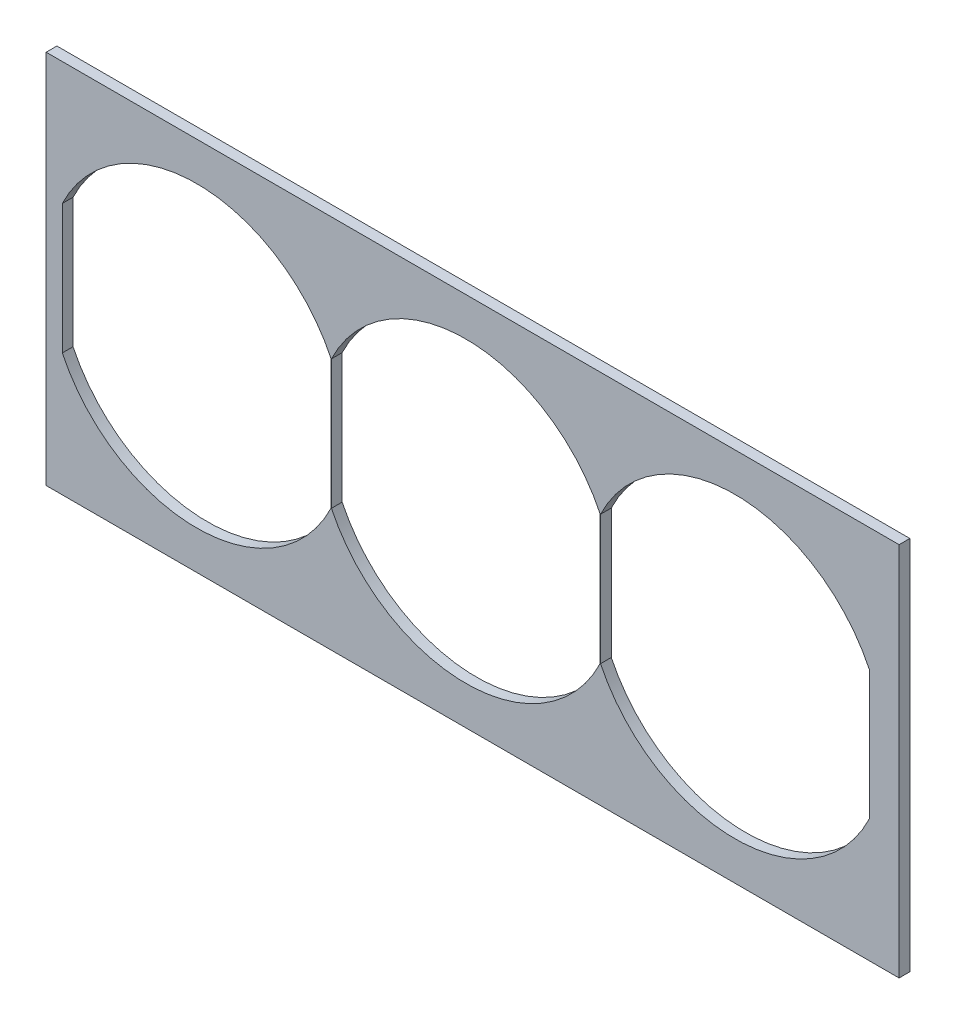
ISO-10303-21;
HEADER;
FILE_DESCRIPTION(('STEP AP214'),'2;1');
FILE_NAME('part.step','',(''),(''),'','','');
FILE_SCHEMA(('AUTOMOTIVE_DESIGN { 1 0 10303 214 1 1 1 1 }'));
ENDSEC;
DATA;
#1=APPLICATION_CONTEXT('core data for automotive mechanical design processes');
#2=APPLICATION_PROTOCOL_DEFINITION('international standard','automotive_design',2000,#1);
#3=PRODUCT_CONTEXT('',#1,'mechanical');
#4=PRODUCT('Part','Part','',(#3));
#5=PRODUCT_RELATED_PRODUCT_CATEGORY('part','',(#4));
#6=PRODUCT_DEFINITION_FORMATION('','',#4);
#7=PRODUCT_DEFINITION_CONTEXT('part definition',#1,'design');
#8=PRODUCT_DEFINITION('design','',#6,#7);
#9=PRODUCT_DEFINITION_SHAPE('','',#8);
#10=(LENGTH_UNIT() NAMED_UNIT(*) SI_UNIT(.MILLI.,.METRE.));
#11=(NAMED_UNIT(*) PLANE_ANGLE_UNIT() SI_UNIT($,.RADIAN.));
#12=(NAMED_UNIT(*) SI_UNIT($,.STERADIAN.) SOLID_ANGLE_UNIT());
#13=UNCERTAINTY_MEASURE_WITH_UNIT(LENGTH_MEASURE(1.E-05),#10,'distance_accuracy_value','');
#14=(GEOMETRIC_REPRESENTATION_CONTEXT(3) GLOBAL_UNCERTAINTY_ASSIGNED_CONTEXT((#13)) GLOBAL_UNIT_ASSIGNED_CONTEXT((#10,
#11,#12)) REPRESENTATION_CONTEXT('',''));
#15=CARTESIAN_POINT('',(0.,0.,0.));
#16=DIRECTION('',(0.,0.,1.));
#17=DIRECTION('',(1.,0.,0.));
#18=AXIS2_PLACEMENT_3D('',#15,#16,#17);
#19=CARTESIAN_POINT('',(158.75,-69.85,4.));
#20=DIRECTION('',(-1.,0.,0.));
#21=DIRECTION('',(0.,0.,1.));
#22=AXIS2_PLACEMENT_3D('',#19,#20,#21);
#23=PLANE('',#22);
#24=DIRECTION('',(0.,1.,0.));
#25=VECTOR('',#24,1.);
#26=CARTESIAN_POINT('',(158.75,-69.85,0.));
#27=LINE('',#26,#25);
#28=CARTESIAN_POINT('',(158.75,-69.85,0.));
#29=VERTEX_POINT('',#28);
#30=CARTESIAN_POINT('',(158.75,69.85,0.));
#31=VERTEX_POINT('',#30);
#32=EDGE_CURVE('E213',#29,#31,#27,.T.);
#33=ORIENTED_EDGE('',*,*,#32,.T.);
#34=DIRECTION('',(0.,0.,-1.));
#35=VECTOR('',#34,1.);
#36=CARTESIAN_POINT('',(158.75,69.85,4.));
#37=LINE('',#36,#35);
#38=CARTESIAN_POINT('',(158.75,69.85,4.));
#39=VERTEX_POINT('',#38);
#40=EDGE_CURVE('E246',#39,#31,#37,.T.);
#41=ORIENTED_EDGE('',*,*,#40,.F.);
#42=DIRECTION('',(0.,1.,0.));
#43=VECTOR('',#42,1.);
#44=CARTESIAN_POINT('',(158.75,-69.85,4.));
#45=LINE('',#44,#43);
#46=CARTESIAN_POINT('',(158.75,-69.85,4.));
#47=VERTEX_POINT('',#46);
#48=EDGE_CURVE('E220',#47,#39,#45,.T.);
#49=ORIENTED_EDGE('',*,*,#48,.F.);
#50=DIRECTION('',(0.,0.,-1.));
#51=VECTOR('',#50,1.);
#52=CARTESIAN_POINT('',(158.75,-69.85,4.));
#53=LINE('',#52,#51);
#54=EDGE_CURVE('E230',#47,#29,#53,.T.);
#55=ORIENTED_EDGE('',*,*,#54,.T.);
#56=EDGE_LOOP('',(#33,#41,#49,#55));
#57=FACE_BOUND('',#56,.T.);
#58=ADVANCED_FACE('F37',(#57),#23,.F.);
#59=CARTESIAN_POINT('',(-158.75,69.85,4.));
#60=DIRECTION('',(0.,-1.,0.));
#61=DIRECTION('',(0.,0.,-1.));
#62=AXIS2_PLACEMENT_3D('',#59,#60,#61);
#63=PLANE('',#62);
#64=DIRECTION('',(-1.,0.,0.));
#65=VECTOR('',#64,1.);
#66=CARTESIAN_POINT('',(-158.75,69.85,0.));
#67=LINE('',#66,#65);
#68=CARTESIAN_POINT('',(-158.75,69.85,0.));
#69=VERTEX_POINT('',#68);
#70=EDGE_CURVE('E233',#31,#69,#67,.T.);
#71=ORIENTED_EDGE('',*,*,#70,.T.);
#72=DIRECTION('',(0.,0.,-1.));
#73=VECTOR('',#72,1.);
#74=CARTESIAN_POINT('',(-158.75,69.85,4.));
#75=LINE('',#74,#73);
#76=CARTESIAN_POINT('',(-158.75,69.85,4.));
#77=VERTEX_POINT('',#76);
#78=EDGE_CURVE('E243',#77,#69,#75,.T.);
#79=ORIENTED_EDGE('',*,*,#78,.F.);
#80=DIRECTION('',(-1.,0.,0.));
#81=VECTOR('',#80,1.);
#82=CARTESIAN_POINT('',(-158.75,69.85,4.));
#83=LINE('',#82,#81);
#84=EDGE_CURVE('E223',#39,#77,#83,.T.);
#85=ORIENTED_EDGE('',*,*,#84,.F.);
#86=ORIENTED_EDGE('',*,*,#40,.T.);
#87=EDGE_LOOP('',(#71,#79,#85,#86));
#88=FACE_BOUND('',#87,.T.);
#89=ADVANCED_FACE('F303',(#88),#63,.F.);
#90=CARTESIAN_POINT('',(-158.75,-69.85,4.));
#91=DIRECTION('',(1.,0.,0.));
#92=DIRECTION('',(0.,0.,-1.));
#93=AXIS2_PLACEMENT_3D('',#90,#91,#92);
#94=PLANE('',#93);
#95=DIRECTION('',(0.,-1.,0.));
#96=VECTOR('',#95,1.);
#97=CARTESIAN_POINT('',(-158.75,-69.85,0.));
#98=LINE('',#97,#96);
#99=CARTESIAN_POINT('',(-158.75,-69.85,0.));
#100=VERTEX_POINT('',#99);
#101=EDGE_CURVE('E235',#69,#100,#98,.T.);
#102=ORIENTED_EDGE('',*,*,#101,.T.);
#103=DIRECTION('',(0.,0.,-1.));
#104=VECTOR('',#103,1.);
#105=CARTESIAN_POINT('',(-158.75,-69.85,4.));
#106=LINE('',#105,#104);
#107=CARTESIAN_POINT('',(-158.75,-69.85,4.));
#108=VERTEX_POINT('',#107);
#109=EDGE_CURVE('E240',#108,#100,#106,.T.);
#110=ORIENTED_EDGE('',*,*,#109,.F.);
#111=DIRECTION('',(0.,-1.,0.));
#112=VECTOR('',#111,1.);
#113=CARTESIAN_POINT('',(-158.75,-69.85,4.));
#114=LINE('',#113,#112);
#115=EDGE_CURVE('E226',#77,#108,#114,.T.);
#116=ORIENTED_EDGE('',*,*,#115,.F.);
#117=ORIENTED_EDGE('',*,*,#78,.T.);
#118=EDGE_LOOP('',(#102,#110,#116,#117));
#119=FACE_BOUND('',#118,.T.);
#120=ADVANCED_FACE('F298',(#119),#94,.F.);
#121=CARTESIAN_POINT('',(-158.75,-69.85,4.));
#122=DIRECTION('',(0.,1.,0.));
#123=DIRECTION('',(0.,0.,1.));
#124=AXIS2_PLACEMENT_3D('',#121,#122,#123);
#125=PLANE('',#124);
#126=DIRECTION('',(1.,0.,0.));
#127=VECTOR('',#126,1.);
#128=CARTESIAN_POINT('',(-158.75,-69.85,0.));
#129=LINE('',#128,#127);
#130=EDGE_CURVE('E224',#100,#29,#129,.T.);
#131=ORIENTED_EDGE('',*,*,#130,.T.);
#132=ORIENTED_EDGE('',*,*,#54,.F.);
#133=DIRECTION('',(1.,0.,0.));
#134=VECTOR('',#133,1.);
#135=CARTESIAN_POINT('',(-158.75,-69.85,4.));
#136=LINE('',#135,#134);
#137=EDGE_CURVE('E228',#108,#47,#136,.T.);
#138=ORIENTED_EDGE('',*,*,#137,.F.);
#139=ORIENTED_EDGE('',*,*,#109,.T.);
#140=EDGE_LOOP('',(#131,#132,#138,#139));
#141=FACE_BOUND('',#140,.T.);
#142=ADVANCED_FACE('F290',(#141),#125,.F.);
#143=CARTESIAN_POINT('',(0.,0.,4.));
#144=DIRECTION('',(0.,0.,-1.));
#145=DIRECTION('',(-1.,0.,0.));
#146=AXIS2_PLACEMENT_3D('',#143,#144,#145);
#147=PLANE('',#146);
#148=DIRECTION('',(0.,-1.,0.));
#149=VECTOR('',#148,1.);
#150=CARTESIAN_POINT('',(-152.7432,-24.0941777199389,4.));
#151=LINE('',#150,#149);
#152=CARTESIAN_POINT('',(-152.7432,24.0941777199389,4.));
#153=VERTEX_POINT('',#152);
#154=CARTESIAN_POINT('',(-152.7432,-24.0941777199389,4.));
#155=VERTEX_POINT('',#154);
#156=EDGE_CURVE('E183',#153,#155,#151,.T.);
#157=ORIENTED_EDGE('',*,*,#156,.F.);
#158=CARTESIAN_POINT('',(-102.7178,0.,4.));
#159=DIRECTION('',(0.,0.,1.));
#160=DIRECTION('',(1.,0.,0.));
#161=AXIS2_PLACEMENT_3D('',#158,#159,#160);
#162=CIRCLE('',#161,55.5254);
#163=CARTESIAN_POINT('',(-52.6924000000001,24.0941777199389,4.));
#164=VERTEX_POINT('',#163);
#165=EDGE_CURVE('E51',#164,#153,#162,.T.);
#166=ORIENTED_EDGE('',*,*,#165,.F.);
#167=DIRECTION('',(0.,1.,0.));
#168=VECTOR('',#167,1.);
#169=CARTESIAN_POINT('',(-52.6924,-24.0941777199389,4.));
#170=LINE('',#169,#168);
#171=CARTESIAN_POINT('',(-52.6924,-24.0941777199389,4.));
#172=VERTEX_POINT('',#171);
#173=EDGE_CURVE('E189',#172,#164,#170,.T.);
#174=ORIENTED_EDGE('',*,*,#173,.F.);
#175=CARTESIAN_POINT('',(-102.7178,0.,4.));
#176=DIRECTION('',(0.,0.,1.));
#177=DIRECTION('',(1.,0.,0.));
#178=AXIS2_PLACEMENT_3D('',#175,#176,#177);
#179=CIRCLE('',#178,55.5254);
#180=EDGE_CURVE('E186',#155,#172,#179,.T.);
#181=ORIENTED_EDGE('',*,*,#180,.F.);
#182=EDGE_LOOP('',(#157,#166,#174,#181));
#183=FACE_BOUND('',#182,.T.);
#184=DIRECTION('',(0.,-1.,0.));
#185=VECTOR('',#184,1.);
#186=CARTESIAN_POINT('',(47.6124,-24.0941777199391,4.));
#187=LINE('',#186,#185);
#188=CARTESIAN_POINT('',(47.6124,24.0941777199388,4.));
#189=VERTEX_POINT('',#188);
#190=CARTESIAN_POINT('',(47.6124,-24.0941777199391,4.));
#191=VERTEX_POINT('',#190);
#192=EDGE_CURVE('E165',#189,#191,#187,.T.);
#193=ORIENTED_EDGE('',*,*,#192,.F.);
#194=CARTESIAN_POINT('',(97.6378,-1.26105038336764E-13,4.));
#195=DIRECTION('',(0.,0.,1.));
#196=DIRECTION('',(1.,0.,0.));
#197=AXIS2_PLACEMENT_3D('',#194,#195,#196);
#198=CIRCLE('',#197,55.5254);
#199=CARTESIAN_POINT('',(147.6632,24.0941777199388,4.));
#200=VERTEX_POINT('',#199);
#201=EDGE_CURVE('E59',#200,#189,#198,.T.);
#202=ORIENTED_EDGE('',*,*,#201,.F.);
#203=DIRECTION('',(0.,1.,0.));
#204=VECTOR('',#203,1.);
#205=CARTESIAN_POINT('',(147.6632,-24.0941777199391,4.));
#206=LINE('',#205,#204);
#207=CARTESIAN_POINT('',(147.6632,-24.0941777199391,4.));
#208=VERTEX_POINT('',#207);
#209=EDGE_CURVE('E172',#208,#200,#206,.T.);
#210=ORIENTED_EDGE('',*,*,#209,.F.);
#211=CARTESIAN_POINT('',(97.6378,-1.26105038336764E-13,4.));
#212=DIRECTION('',(0.,0.,1.));
#213=DIRECTION('',(1.,0.,0.));
#214=AXIS2_PLACEMENT_3D('',#211,#212,#213);
#215=CIRCLE('',#214,55.5254);
#216=EDGE_CURVE('E155',#191,#208,#215,.T.);
#217=ORIENTED_EDGE('',*,*,#216,.F.);
#218=EDGE_LOOP('',(#193,#202,#210,#217));
#219=FACE_BOUND('',#218,.T.);
#220=DIRECTION('',(0.,-1.,0.));
#221=VECTOR('',#220,1.);
#222=CARTESIAN_POINT('',(-52.5654,-24.0941777199389,4.));
#223=LINE('',#222,#221);
#224=CARTESIAN_POINT('',(-52.5654,24.0941777199389,4.));
#225=VERTEX_POINT('',#224);
#226=CARTESIAN_POINT('',(-52.5654,-24.0941777199389,4.));
#227=VERTEX_POINT('',#226);
#228=EDGE_CURVE('E201',#225,#227,#223,.T.);
#229=ORIENTED_EDGE('',*,*,#228,.F.);
#230=CARTESIAN_POINT('',(-2.54,0.,4.));
#231=DIRECTION('',(0.,0.,1.));
#232=DIRECTION('',(1.,0.,0.));
#233=AXIS2_PLACEMENT_3D('',#230,#231,#232);
#234=CIRCLE('',#233,55.5254);
#235=CARTESIAN_POINT('',(47.4854,24.0941777199389,4.));
#236=VERTEX_POINT('',#235);
#237=EDGE_CURVE('E179',#236,#225,#234,.T.);
#238=ORIENTED_EDGE('',*,*,#237,.F.);
#239=DIRECTION('',(0.,1.,0.));
#240=VECTOR('',#239,1.);
#241=CARTESIAN_POINT('',(47.4854,-24.0941777199389,4.));
#242=LINE('',#241,#240);
#243=CARTESIAN_POINT('',(47.4854,-24.0941777199389,4.));
#244=VERTEX_POINT('',#243);
#245=EDGE_CURVE('E207',#244,#236,#242,.T.);
#246=ORIENTED_EDGE('',*,*,#245,.F.);
#247=CARTESIAN_POINT('',(-2.54,0.,4.));
#248=DIRECTION('',(0.,0.,1.));
#249=DIRECTION('',(1.,0.,0.));
#250=AXIS2_PLACEMENT_3D('',#247,#248,#249);
#251=CIRCLE('',#250,55.5254);
#252=EDGE_CURVE('E204',#227,#244,#251,.T.);
#253=ORIENTED_EDGE('',*,*,#252,.F.);
#254=EDGE_LOOP('',(#229,#238,#246,#253));
#255=FACE_BOUND('',#254,.T.);
#256=ORIENTED_EDGE('',*,*,#48,.T.);
#257=ORIENTED_EDGE('',*,*,#84,.T.);
#258=ORIENTED_EDGE('',*,*,#115,.T.);
#259=ORIENTED_EDGE('',*,*,#137,.T.);
#260=EDGE_LOOP('',(#256,#257,#258,#259));
#261=FACE_BOUND('',#260,.T.);
#262=ADVANCED_FACE('F169',(#183,#219,#255,#261),#147,.F.);
#263=CARTESIAN_POINT('',(0.,0.,0.));
#264=DIRECTION('',(0.,0.,-1.));
#265=DIRECTION('',(-1.,0.,0.));
#266=AXIS2_PLACEMENT_3D('',#263,#264,#265);
#267=PLANE('',#266);
#268=CARTESIAN_POINT('',(-102.7178,0.,0.));
#269=DIRECTION('',(0.,0.,-1.));
#270=DIRECTION('',(-1.,0.,0.));
#271=AXIS2_PLACEMENT_3D('',#268,#269,#270);
#272=CIRCLE('',#271,55.5254);
#273=CARTESIAN_POINT('',(-152.7432,24.0941777199389,0.));
#274=VERTEX_POINT('',#273);
#275=CARTESIAN_POINT('',(-52.6924000000001,24.0941777199389,0.));
#276=VERTEX_POINT('',#275);
#277=EDGE_CURVE('E11',#274,#276,#272,.T.);
#278=ORIENTED_EDGE('',*,*,#277,.F.);
#279=DIRECTION('',(0.,1.,0.));
#280=VECTOR('',#279,1.);
#281=CARTESIAN_POINT('',(-152.7432,0.,0.));
#282=LINE('',#281,#280);
#283=CARTESIAN_POINT('',(-152.7432,-24.0941777199389,0.));
#284=VERTEX_POINT('',#283);
#285=EDGE_CURVE('E265',#284,#274,#282,.T.);
#286=ORIENTED_EDGE('',*,*,#285,.F.);
#287=CARTESIAN_POINT('',(-102.7178,0.,0.));
#288=DIRECTION('',(0.,0.,-1.));
#289=DIRECTION('',(-1.,0.,0.));
#290=AXIS2_PLACEMENT_3D('',#287,#288,#289);
#291=CIRCLE('',#290,55.5254);
#292=CARTESIAN_POINT('',(-52.6924,-24.0941777199389,0.));
#293=VERTEX_POINT('',#292);
#294=EDGE_CURVE('E267',#293,#284,#291,.T.);
#295=ORIENTED_EDGE('',*,*,#294,.F.);
#296=DIRECTION('',(0.,-1.,0.));
#297=VECTOR('',#296,1.);
#298=CARTESIAN_POINT('',(-52.6924,0.,0.));
#299=LINE('',#298,#297);
#300=EDGE_CURVE('E44',#276,#293,#299,.T.);
#301=ORIENTED_EDGE('',*,*,#300,.F.);
#302=EDGE_LOOP('',(#278,#286,#295,#301));
#303=FACE_BOUND('',#302,.T.);
#304=CARTESIAN_POINT('',(97.6378,-1.26105038336764E-13,0.));
#305=DIRECTION('',(0.,0.,-1.));
#306=DIRECTION('',(-1.,0.,0.));
#307=AXIS2_PLACEMENT_3D('',#304,#305,#306);
#308=CIRCLE('',#307,55.5254);
#309=CARTESIAN_POINT('',(47.6124,24.0941777199388,0.));
#310=VERTEX_POINT('',#309);
#311=CARTESIAN_POINT('',(147.6632,24.0941777199388,0.));
#312=VERTEX_POINT('',#311);
#313=EDGE_CURVE('E263',#310,#312,#308,.T.);
#314=ORIENTED_EDGE('',*,*,#313,.F.);
#315=DIRECTION('',(0.,1.,0.));
#316=VECTOR('',#315,1.);
#317=CARTESIAN_POINT('',(47.6124,0.,0.));
#318=LINE('',#317,#316);
#319=CARTESIAN_POINT('',(47.6124,-24.0941777199391,0.));
#320=VERTEX_POINT('',#319);
#321=EDGE_CURVE('E258',#320,#310,#318,.T.);
#322=ORIENTED_EDGE('',*,*,#321,.F.);
#323=CARTESIAN_POINT('',(97.6378,-1.26105038336764E-13,0.));
#324=DIRECTION('',(0.,0.,-1.));
#325=DIRECTION('',(-1.,0.,0.));
#326=AXIS2_PLACEMENT_3D('',#323,#324,#325);
#327=CIRCLE('',#326,55.5254);
#328=CARTESIAN_POINT('',(147.6632,-24.0941777199391,0.));
#329=VERTEX_POINT('',#328);
#330=EDGE_CURVE('E158',#329,#320,#327,.T.);
#331=ORIENTED_EDGE('',*,*,#330,.F.);
#332=DIRECTION('',(0.,-1.,0.));
#333=VECTOR('',#332,1.);
#334=CARTESIAN_POINT('',(147.6632,-1.70102385766586E-13,0.));
#335=LINE('',#334,#333);
#336=EDGE_CURVE('E261',#312,#329,#335,.T.);
#337=ORIENTED_EDGE('',*,*,#336,.F.);
#338=EDGE_LOOP('',(#314,#322,#331,#337));
#339=FACE_BOUND('',#338,.T.);
#340=CARTESIAN_POINT('',(-2.54,0.,0.));
#341=DIRECTION('',(0.,0.,-1.));
#342=DIRECTION('',(-1.,0.,0.));
#343=AXIS2_PLACEMENT_3D('',#340,#341,#342);
#344=CIRCLE('',#343,55.5254);
#345=CARTESIAN_POINT('',(-52.5654,24.0941777199389,0.));
#346=VERTEX_POINT('',#345);
#347=CARTESIAN_POINT('',(47.4854,24.0941777199389,0.));
#348=VERTEX_POINT('',#347);
#349=EDGE_CURVE('E256',#346,#348,#344,.T.);
#350=ORIENTED_EDGE('',*,*,#349,.F.);
#351=DIRECTION('',(0.,1.,0.));
#352=VECTOR('',#351,1.);
#353=CARTESIAN_POINT('',(-52.5654,0.,0.));
#354=LINE('',#353,#352);
#355=CARTESIAN_POINT('',(-52.5654,-24.0941777199389,0.));
#356=VERTEX_POINT('',#355);
#357=EDGE_CURVE('E249',#356,#346,#354,.T.);
#358=ORIENTED_EDGE('',*,*,#357,.F.);
#359=CARTESIAN_POINT('',(-2.54,0.,0.));
#360=DIRECTION('',(0.,0.,-1.));
#361=DIRECTION('',(-1.,0.,0.));
#362=AXIS2_PLACEMENT_3D('',#359,#360,#361);
#363=CIRCLE('',#362,55.5254);
#364=CARTESIAN_POINT('',(47.4854,-24.0941777199389,0.));
#365=VERTEX_POINT('',#364);
#366=EDGE_CURVE('E251',#365,#356,#363,.T.);
#367=ORIENTED_EDGE('',*,*,#366,.F.);
#368=DIRECTION('',(0.,-1.,0.));
#369=VECTOR('',#368,1.);
#370=CARTESIAN_POINT('',(47.4854,0.,0.));
#371=LINE('',#370,#369);
#372=EDGE_CURVE('E254',#348,#365,#371,.T.);
#373=ORIENTED_EDGE('',*,*,#372,.F.);
#374=EDGE_LOOP('',(#350,#358,#367,#373));
#375=FACE_BOUND('',#374,.T.);
#376=ORIENTED_EDGE('',*,*,#32,.F.);
#377=ORIENTED_EDGE('',*,*,#130,.F.);
#378=ORIENTED_EDGE('',*,*,#101,.F.);
#379=ORIENTED_EDGE('',*,*,#70,.F.);
#380=EDGE_LOOP('',(#376,#377,#378,#379));
#381=FACE_BOUND('',#380,.T.);
#382=ADVANCED_FACE('F282',(#303,#339,#375,#381),#267,.T.);
#383=CARTESIAN_POINT('',(-2.54,0.,-6.));
#384=DIRECTION('',(0.,0.,1.));
#385=DIRECTION('',(1.,0.,0.));
#386=AXIS2_PLACEMENT_3D('',#383,#384,#385);
#387=CYLINDRICAL_SURFACE('',#386,55.5254);
#388=ORIENTED_EDGE('',*,*,#349,.T.);
#389=DIRECTION('',(0.,0.,1.));
#390=VECTOR('',#389,1.);
#391=CARTESIAN_POINT('',(47.4854,24.0941777199389,-6.));
#392=LINE('',#391,#390);
#393=EDGE_CURVE('E211',#348,#236,#392,.T.);
#394=ORIENTED_EDGE('',*,*,#393,.T.);
#395=ORIENTED_EDGE('',*,*,#237,.T.);
#396=DIRECTION('',(0.,0.,1.));
#397=VECTOR('',#396,1.);
#398=CARTESIAN_POINT('',(-52.5654,24.0941777199389,-6.));
#399=LINE('',#398,#397);
#400=EDGE_CURVE('E210',#346,#225,#399,.T.);
#401=ORIENTED_EDGE('',*,*,#400,.F.);
#402=EDGE_LOOP('',(#388,#394,#395,#401));
#403=FACE_BOUND('',#402,.T.);
#404=ADVANCED_FACE('F296',(#403),#387,.F.);
#405=CARTESIAN_POINT('',(47.4854,-24.0941777199389,-6.));
#406=DIRECTION('',(1.,0.,0.));
#407=DIRECTION('',(0.,0.,-1.));
#408=AXIS2_PLACEMENT_3D('',#405,#406,#407);
#409=PLANE('',#408);
#410=ORIENTED_EDGE('',*,*,#372,.T.);
#411=DIRECTION('',(0.,0.,1.));
#412=VECTOR('',#411,1.);
#413=CARTESIAN_POINT('',(47.4854,-24.0941777199389,-6.));
#414=LINE('',#413,#412);
#415=EDGE_CURVE('E214',#365,#244,#414,.T.);
#416=ORIENTED_EDGE('',*,*,#415,.T.);
#417=ORIENTED_EDGE('',*,*,#245,.T.);
#418=ORIENTED_EDGE('',*,*,#393,.F.);
#419=EDGE_LOOP('',(#410,#416,#417,#418));
#420=FACE_BOUND('',#419,.T.);
#421=ADVANCED_FACE('F351',(#420),#409,.F.);
#422=CARTESIAN_POINT('',(-2.54,0.,-6.));
#423=DIRECTION('',(0.,0.,1.));
#424=DIRECTION('',(1.,0.,0.));
#425=AXIS2_PLACEMENT_3D('',#422,#423,#424);
#426=CYLINDRICAL_SURFACE('',#425,55.5254);
#427=ORIENTED_EDGE('',*,*,#366,.T.);
#428=DIRECTION('',(0.,0.,1.));
#429=VECTOR('',#428,1.);
#430=CARTESIAN_POINT('',(-52.5654,-24.0941777199389,-6.));
#431=LINE('',#430,#429);
#432=EDGE_CURVE('E216',#356,#227,#431,.T.);
#433=ORIENTED_EDGE('',*,*,#432,.T.);
#434=ORIENTED_EDGE('',*,*,#252,.T.);
#435=ORIENTED_EDGE('',*,*,#415,.F.);
#436=EDGE_LOOP('',(#427,#433,#434,#435));
#437=FACE_BOUND('',#436,.T.);
#438=ADVANCED_FACE('F360',(#437),#426,.F.);
#439=CARTESIAN_POINT('',(-52.5654,-24.0941777199389,-6.));
#440=DIRECTION('',(-1.,0.,0.));
#441=DIRECTION('',(0.,0.,1.));
#442=AXIS2_PLACEMENT_3D('',#439,#440,#441);
#443=PLANE('',#442);
#444=ORIENTED_EDGE('',*,*,#357,.T.);
#445=ORIENTED_EDGE('',*,*,#400,.T.);
#446=ORIENTED_EDGE('',*,*,#228,.T.);
#447=ORIENTED_EDGE('',*,*,#432,.F.);
#448=EDGE_LOOP('',(#444,#445,#446,#447));
#449=FACE_BOUND('',#448,.T.);
#450=ADVANCED_FACE('F370',(#449),#443,.F.);
#451=CARTESIAN_POINT('',(97.6378,-1.26105038336764E-13,-6.));
#452=DIRECTION('',(0.,0.,1.));
#453=DIRECTION('',(1.,0.,0.));
#454=AXIS2_PLACEMENT_3D('',#451,#452,#453);
#455=CYLINDRICAL_SURFACE('',#454,55.5254);
#456=ORIENTED_EDGE('',*,*,#313,.T.);
#457=DIRECTION('',(0.,0.,1.));
#458=VECTOR('',#457,1.);
#459=CARTESIAN_POINT('',(147.6632,24.0941777199388,-6.));
#460=LINE('',#459,#458);
#461=EDGE_CURVE('E177',#312,#200,#460,.T.);
#462=ORIENTED_EDGE('',*,*,#461,.T.);
#463=ORIENTED_EDGE('',*,*,#201,.T.);
#464=DIRECTION('',(0.,0.,1.));
#465=VECTOR('',#464,1.);
#466=CARTESIAN_POINT('',(47.6124,24.0941777199388,-6.));
#467=LINE('',#466,#465);
#468=EDGE_CURVE('E162',#310,#189,#467,.T.);
#469=ORIENTED_EDGE('',*,*,#468,.F.);
#470=EDGE_LOOP('',(#456,#462,#463,#469));
#471=FACE_BOUND('',#470,.T.);
#472=ADVANCED_FACE('F380',(#471),#455,.F.);
#473=CARTESIAN_POINT('',(147.6632,-24.0941777199391,-6.));
#474=DIRECTION('',(1.,0.,0.));
#475=DIRECTION('',(0.,1.,0.));
#476=AXIS2_PLACEMENT_3D('',#473,#474,#475);
#477=PLANE('',#476);
#478=ORIENTED_EDGE('',*,*,#336,.T.);
#479=DIRECTION('',(0.,0.,1.));
#480=VECTOR('',#479,1.);
#481=CARTESIAN_POINT('',(147.6632,-24.0941777199391,-6.));
#482=LINE('',#481,#480);
#483=EDGE_CURVE('E161',#329,#208,#482,.T.);
#484=ORIENTED_EDGE('',*,*,#483,.T.);
#485=ORIENTED_EDGE('',*,*,#209,.T.);
#486=ORIENTED_EDGE('',*,*,#461,.F.);
#487=EDGE_LOOP('',(#478,#484,#485,#486));
#488=FACE_BOUND('',#487,.T.);
#489=ADVANCED_FACE('F390',(#488),#477,.F.);
#490=CARTESIAN_POINT('',(97.6378,-1.26105038336764E-13,-6.));
#491=DIRECTION('',(0.,0.,1.));
#492=DIRECTION('',(1.,0.,0.));
#493=AXIS2_PLACEMENT_3D('',#490,#491,#492);
#494=CYLINDRICAL_SURFACE('',#493,55.5254);
#495=ORIENTED_EDGE('',*,*,#330,.T.);
#496=DIRECTION('',(0.,0.,1.));
#497=VECTOR('',#496,1.);
#498=CARTESIAN_POINT('',(47.6124,-24.0941777199391,-6.));
#499=LINE('',#498,#497);
#500=EDGE_CURVE('E150',#320,#191,#499,.T.);
#501=ORIENTED_EDGE('',*,*,#500,.T.);
#502=ORIENTED_EDGE('',*,*,#216,.T.);
#503=ORIENTED_EDGE('',*,*,#483,.F.);
#504=EDGE_LOOP('',(#495,#501,#502,#503));
#505=FACE_BOUND('',#504,.T.);
#506=ADVANCED_FACE('F152',(#505),#494,.F.);
#507=CARTESIAN_POINT('',(47.6124,-24.0941777199391,-6.));
#508=DIRECTION('',(-1.,0.,0.));
#509=DIRECTION('',(0.,0.,1.));
#510=AXIS2_PLACEMENT_3D('',#507,#508,#509);
#511=PLANE('',#510);
#512=ORIENTED_EDGE('',*,*,#321,.T.);
#513=ORIENTED_EDGE('',*,*,#468,.T.);
#514=ORIENTED_EDGE('',*,*,#192,.T.);
#515=ORIENTED_EDGE('',*,*,#500,.F.);
#516=EDGE_LOOP('',(#512,#513,#514,#515));
#517=FACE_BOUND('',#516,.T.);
#518=ADVANCED_FACE('F166',(#517),#511,.F.);
#519=CARTESIAN_POINT('',(-102.7178,0.,-6.));
#520=DIRECTION('',(0.,0.,1.));
#521=DIRECTION('',(1.,0.,0.));
#522=AXIS2_PLACEMENT_3D('',#519,#520,#521);
#523=CYLINDRICAL_SURFACE('',#522,55.5254);
#524=ORIENTED_EDGE('',*,*,#277,.T.);
#525=DIRECTION('',(0.,0.,1.));
#526=VECTOR('',#525,1.);
#527=CARTESIAN_POINT('',(-52.6924000000001,24.0941777199389,-6.));
#528=LINE('',#527,#526);
#529=EDGE_CURVE('E193',#276,#164,#528,.T.);
#530=ORIENTED_EDGE('',*,*,#529,.T.);
#531=ORIENTED_EDGE('',*,*,#165,.T.);
#532=DIRECTION('',(0.,0.,1.));
#533=VECTOR('',#532,1.);
#534=CARTESIAN_POINT('',(-152.7432,24.0941777199389,-6.));
#535=LINE('',#534,#533);
#536=EDGE_CURVE('E192',#274,#153,#535,.T.);
#537=ORIENTED_EDGE('',*,*,#536,.F.);
#538=EDGE_LOOP('',(#524,#530,#531,#537));
#539=FACE_BOUND('',#538,.T.);
#540=ADVANCED_FACE('F287',(#539),#523,.F.);
#541=CARTESIAN_POINT('',(-52.6924,-24.0941777199389,-6.));
#542=DIRECTION('',(1.,0.,0.));
#543=DIRECTION('',(0.,1.,0.));
#544=AXIS2_PLACEMENT_3D('',#541,#542,#543);
#545=PLANE('',#544);
#546=ORIENTED_EDGE('',*,*,#300,.T.);
#547=DIRECTION('',(0.,0.,1.));
#548=VECTOR('',#547,1.);
#549=CARTESIAN_POINT('',(-52.6924,-24.0941777199389,-6.));
#550=LINE('',#549,#548);
#551=EDGE_CURVE('E195',#293,#172,#550,.T.);
#552=ORIENTED_EDGE('',*,*,#551,.T.);
#553=ORIENTED_EDGE('',*,*,#173,.T.);
#554=ORIENTED_EDGE('',*,*,#529,.F.);
#555=EDGE_LOOP('',(#546,#552,#553,#554));
#556=FACE_BOUND('',#555,.T.);
#557=ADVANCED_FACE('F273',(#556),#545,.F.);
#558=CARTESIAN_POINT('',(-102.7178,0.,-6.));
#559=DIRECTION('',(0.,0.,1.));
#560=DIRECTION('',(1.,0.,0.));
#561=AXIS2_PLACEMENT_3D('',#558,#559,#560);
#562=CYLINDRICAL_SURFACE('',#561,55.5254);
#563=ORIENTED_EDGE('',*,*,#294,.T.);
#564=DIRECTION('',(0.,0.,1.));
#565=VECTOR('',#564,1.);
#566=CARTESIAN_POINT('',(-152.7432,-24.0941777199389,-6.));
#567=LINE('',#566,#565);
#568=EDGE_CURVE('E197',#284,#155,#567,.T.);
#569=ORIENTED_EDGE('',*,*,#568,.T.);
#570=ORIENTED_EDGE('',*,*,#180,.T.);
#571=ORIENTED_EDGE('',*,*,#551,.F.);
#572=EDGE_LOOP('',(#563,#569,#570,#571));
#573=FACE_BOUND('',#572,.T.);
#574=ADVANCED_FACE('F278',(#573),#562,.F.);
#575=CARTESIAN_POINT('',(-152.7432,-24.0941777199389,-6.));
#576=DIRECTION('',(-1.,0.,0.));
#577=DIRECTION('',(0.,-1.,0.));
#578=AXIS2_PLACEMENT_3D('',#575,#576,#577);
#579=PLANE('',#578);
#580=ORIENTED_EDGE('',*,*,#285,.T.);
#581=ORIENTED_EDGE('',*,*,#536,.T.);
#582=ORIENTED_EDGE('',*,*,#156,.T.);
#583=ORIENTED_EDGE('',*,*,#568,.F.);
#584=EDGE_LOOP('',(#580,#581,#582,#583));
#585=FACE_BOUND('',#584,.T.);
#586=ADVANCED_FACE('F285',(#585),#579,.F.);
#587=CLOSED_SHELL('',(#58,#89,#120,#142,#262,#382,#404,#421,#438,#450,#472,#489,#506,#518,#540,
#557,#574,#586));
#588=MANIFOLD_SOLID_BREP('B2',#587);
#589=ADVANCED_BREP_SHAPE_REPRESENTATION('',(#18,#588),#14);
#590=SHAPE_DEFINITION_REPRESENTATION(#9,#589);
ENDSEC;
END-ISO-10303-21;
